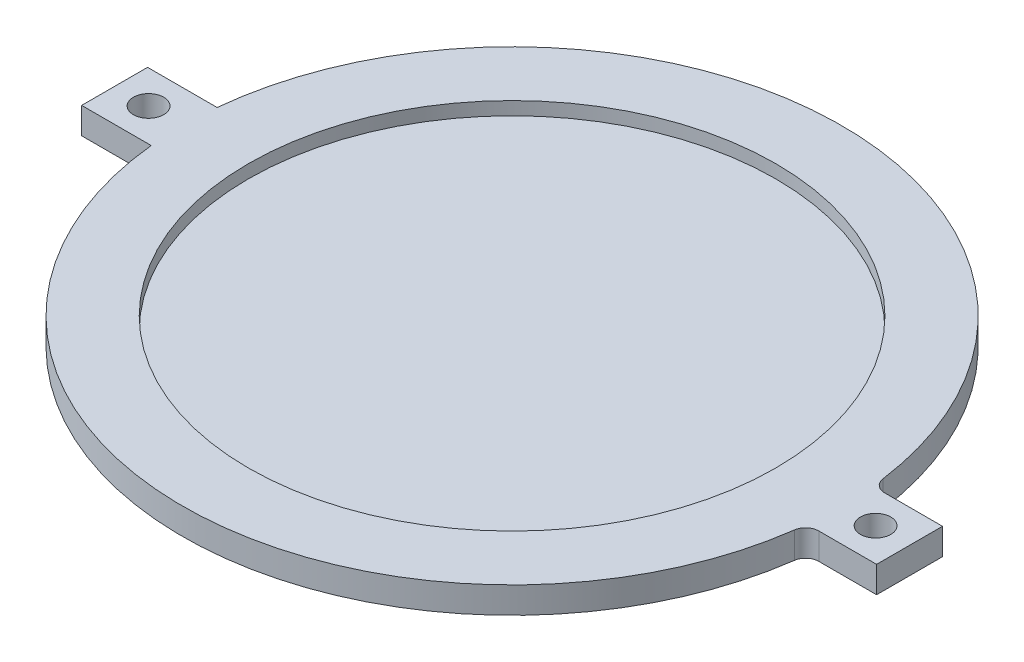
ISO-10303-21;
HEADER;
FILE_DESCRIPTION(('STEP AP214'),'2;1');
FILE_NAME('part.step','',(''),(''),'','','');
FILE_SCHEMA(('AUTOMOTIVE_DESIGN { 1 0 10303 214 1 1 1 1 }'));
ENDSEC;
DATA;
#1=APPLICATION_CONTEXT('core data for automotive mechanical design processes');
#2=APPLICATION_PROTOCOL_DEFINITION('international standard','automotive_design',2000,#1);
#3=PRODUCT_CONTEXT('',#1,'mechanical');
#4=PRODUCT('Part','Part','',(#3));
#5=PRODUCT_RELATED_PRODUCT_CATEGORY('part','',(#4));
#6=PRODUCT_DEFINITION_FORMATION('','',#4);
#7=PRODUCT_DEFINITION_CONTEXT('part definition',#1,'design');
#8=PRODUCT_DEFINITION('design','',#6,#7);
#9=PRODUCT_DEFINITION_SHAPE('','',#8);
#10=(LENGTH_UNIT() NAMED_UNIT(*) SI_UNIT(.MILLI.,.METRE.));
#11=(NAMED_UNIT(*) PLANE_ANGLE_UNIT() SI_UNIT($,.RADIAN.));
#12=(NAMED_UNIT(*) SI_UNIT($,.STERADIAN.) SOLID_ANGLE_UNIT());
#13=UNCERTAINTY_MEASURE_WITH_UNIT(LENGTH_MEASURE(1.E-05),#10,'distance_accuracy_value','');
#14=(GEOMETRIC_REPRESENTATION_CONTEXT(3) GLOBAL_UNCERTAINTY_ASSIGNED_CONTEXT((#13)) GLOBAL_UNIT_ASSIGNED_CONTEXT((#10,
#11,#12)) REPRESENTATION_CONTEXT('',''));
#15=CARTESIAN_POINT('',(0.,0.,0.));
#16=DIRECTION('',(0.,0.,1.));
#17=DIRECTION('',(1.,0.,0.));
#18=AXIS2_PLACEMENT_3D('',#15,#16,#17);
#19=CARTESIAN_POINT('',(0.,2.,0.));
#20=DIRECTION('',(0.,-1.,0.));
#21=DIRECTION('',(0.,0.,-1.));
#22=AXIS2_PLACEMENT_3D('',#19,#20,#21);
#23=CYLINDRICAL_SURFACE('',#22,25.);
#24=CARTESIAN_POINT('',(0.,0.,0.));
#25=DIRECTION('',(0.,1.,0.));
#26=DIRECTION('',(0.,0.,1.));
#27=AXIS2_PLACEMENT_3D('',#24,#25,#26);
#28=CIRCLE('',#27,25.);
#29=CARTESIAN_POINT('',(-24.8746859276655,0.,2.5));
#30=VERTEX_POINT('',#29);
#31=CARTESIAN_POINT('',(24.7724481307466,0.,3.36538461538462));
#32=VERTEX_POINT('',#31);
#33=EDGE_CURVE('E177',#30,#32,#28,.T.);
#34=ORIENTED_EDGE('',*,*,#33,.T.);
#35=DIRECTION('',(0.,-1.,0.));
#36=VECTOR('',#35,1.);
#37=CARTESIAN_POINT('',(24.7724481307466,2.,3.36538461538462));
#38=LINE('',#37,#36);
#39=CARTESIAN_POINT('',(24.7724481307466,2.,3.36538461538462));
#40=VERTEX_POINT('',#39);
#41=EDGE_CURVE('E68',#32,#40,#38,.F.);
#42=ORIENTED_EDGE('',*,*,#41,.T.);
#43=CARTESIAN_POINT('',(0.,2.,0.));
#44=DIRECTION('',(0.,1.,0.));
#45=DIRECTION('',(0.,0.,1.));
#46=AXIS2_PLACEMENT_3D('',#43,#44,#45);
#47=CIRCLE('',#46,25.);
#48=CARTESIAN_POINT('',(-24.8746859276655,2.,2.5));
#49=VERTEX_POINT('',#48);
#50=EDGE_CURVE('E142',#49,#40,#47,.T.);
#51=ORIENTED_EDGE('',*,*,#50,.F.);
#52=DIRECTION('',(0.,-1.,0.));
#53=VECTOR('',#52,1.);
#54=CARTESIAN_POINT('',(-24.8746859276655,2.,2.5));
#55=LINE('',#54,#53);
#56=EDGE_CURVE('E176',#49,#30,#55,.T.);
#57=ORIENTED_EDGE('',*,*,#56,.T.);
#58=EDGE_LOOP('',(#34,#42,#51,#57));
#59=FACE_BOUND('',#58,.T.);
#60=ADVANCED_FACE('F53',(#59),#23,.T.);
#61=CARTESIAN_POINT('',(0.,2.,2.5));
#62=DIRECTION('',(0.,0.,-1.));
#63=DIRECTION('',(-1.,0.,0.));
#64=AXIS2_PLACEMENT_3D('',#61,#62,#63);
#65=PLANE('',#64);
#66=DIRECTION('',(1.,0.,0.));
#67=VECTOR('',#66,1.);
#68=CARTESIAN_POINT('',(0.,2.,2.5));
#69=LINE('',#68,#67);
#70=CARTESIAN_POINT('',(25.7633460559765,2.,2.5));
#71=VERTEX_POINT('',#70);
#72=CARTESIAN_POINT('',(30.15,2.,2.5));
#73=VERTEX_POINT('',#72);
#74=EDGE_CURVE('E130',#71,#73,#69,.T.);
#75=ORIENTED_EDGE('',*,*,#74,.F.);
#76=DIRECTION('',(0.,1.,0.));
#77=VECTOR('',#76,1.);
#78=CARTESIAN_POINT('',(25.7633460559765,0.,2.5));
#79=LINE('',#78,#77);
#80=CARTESIAN_POINT('',(25.7633460559765,0.,2.5));
#81=VERTEX_POINT('',#80);
#82=EDGE_CURVE('E214',#71,#81,#79,.F.);
#83=ORIENTED_EDGE('',*,*,#82,.T.);
#84=DIRECTION('',(1.,0.,0.));
#85=VECTOR('',#84,1.);
#86=CARTESIAN_POINT('',(0.,0.,2.5));
#87=LINE('',#86,#85);
#88=CARTESIAN_POINT('',(30.15,0.,2.5));
#89=VERTEX_POINT('',#88);
#90=EDGE_CURVE('E147',#81,#89,#87,.T.);
#91=ORIENTED_EDGE('',*,*,#90,.T.);
#92=DIRECTION('',(0.,-1.,0.));
#93=VECTOR('',#92,1.);
#94=CARTESIAN_POINT('',(30.15,2.,2.5));
#95=LINE('',#94,#93);
#96=EDGE_CURVE('E145',#73,#89,#95,.T.);
#97=ORIENTED_EDGE('',*,*,#96,.F.);
#98=EDGE_LOOP('',(#75,#83,#91,#97));
#99=FACE_BOUND('',#98,.T.);
#100=ADVANCED_FACE('F146',(#99),#65,.F.);
#101=CARTESIAN_POINT('',(30.15,2.,0.));
#102=DIRECTION('',(-1.,0.,0.));
#103=DIRECTION('',(0.,0.,1.));
#104=AXIS2_PLACEMENT_3D('',#101,#102,#103);
#105=PLANE('',#104);
#106=DIRECTION('',(0.,0.,-1.));
#107=VECTOR('',#106,1.);
#108=CARTESIAN_POINT('',(30.15,0.,0.));
#109=LINE('',#108,#107);
#110=CARTESIAN_POINT('',(30.15,0.,-2.5));
#111=VERTEX_POINT('',#110);
#112=EDGE_CURVE('E182',#89,#111,#109,.T.);
#113=ORIENTED_EDGE('',*,*,#112,.T.);
#114=DIRECTION('',(0.,-1.,0.));
#115=VECTOR('',#114,1.);
#116=CARTESIAN_POINT('',(30.15,2.,-2.5));
#117=LINE('',#116,#115);
#118=CARTESIAN_POINT('',(30.15,2.,-2.5));
#119=VERTEX_POINT('',#118);
#120=EDGE_CURVE('E152',#119,#111,#117,.T.);
#121=ORIENTED_EDGE('',*,*,#120,.F.);
#122=DIRECTION('',(0.,0.,-1.));
#123=VECTOR('',#122,1.);
#124=CARTESIAN_POINT('',(30.15,2.,0.));
#125=LINE('',#124,#123);
#126=EDGE_CURVE('E136',#73,#119,#125,.T.);
#127=ORIENTED_EDGE('',*,*,#126,.F.);
#128=ORIENTED_EDGE('',*,*,#96,.T.);
#129=EDGE_LOOP('',(#113,#121,#127,#128));
#130=FACE_BOUND('',#129,.T.);
#131=ADVANCED_FACE('F154',(#130),#105,.F.);
#132=CARTESIAN_POINT('',(0.,2.,-2.5));
#133=DIRECTION('',(0.,0.,-1.));
#134=DIRECTION('',(-1.,0.,0.));
#135=AXIS2_PLACEMENT_3D('',#132,#133,#134);
#136=PLANE('',#135);
#137=DIRECTION('',(1.,0.,0.));
#138=VECTOR('',#137,1.);
#139=CARTESIAN_POINT('',(0.,0.,-2.5));
#140=LINE('',#139,#138);
#141=CARTESIAN_POINT('',(25.7633460559765,0.,-2.5));
#142=VERTEX_POINT('',#141);
#143=EDGE_CURVE('E184',#142,#111,#140,.T.);
#144=ORIENTED_EDGE('',*,*,#143,.F.);
#145=DIRECTION('',(0.,-1.,0.));
#146=VECTOR('',#145,1.);
#147=CARTESIAN_POINT('',(25.7633460559765,2.,-2.5));
#148=LINE('',#147,#146);
#149=CARTESIAN_POINT('',(25.7633460559765,2.,-2.5));
#150=VERTEX_POINT('',#149);
#151=EDGE_CURVE('E212',#142,#150,#148,.F.);
#152=ORIENTED_EDGE('',*,*,#151,.T.);
#153=DIRECTION('',(1.,0.,0.));
#154=VECTOR('',#153,1.);
#155=CARTESIAN_POINT('',(0.,2.,-2.5));
#156=LINE('',#155,#154);
#157=EDGE_CURVE('E156',#150,#119,#156,.T.);
#158=ORIENTED_EDGE('',*,*,#157,.T.);
#159=ORIENTED_EDGE('',*,*,#120,.T.);
#160=EDGE_LOOP('',(#144,#152,#158,#159));
#161=FACE_BOUND('',#160,.T.);
#162=ADVANCED_FACE('F236',(#161),#136,.T.);
#163=CARTESIAN_POINT('',(24.7724481307466,2.,-3.36538461538462));
#164=VERTEX_POINT('',#163);
#165=CARTESIAN_POINT('',(-24.8746859276655,2.,-2.5));
#166=VERTEX_POINT('',#165);
#167=EDGE_CURVE('E158',#164,#166,#47,.T.);
#168=ORIENTED_EDGE('',*,*,#167,.F.);
#169=DIRECTION('',(0.,-1.,0.));
#170=VECTOR('',#169,1.);
#171=CARTESIAN_POINT('',(24.7724481307466,2.,-3.36538461538462));
#172=LINE('',#171,#170);
#173=CARTESIAN_POINT('',(24.7724481307466,0.,-3.36538461538462));
#174=VERTEX_POINT('',#173);
#175=EDGE_CURVE('E151',#164,#174,#172,.T.);
#176=ORIENTED_EDGE('',*,*,#175,.T.);
#177=CARTESIAN_POINT('',(-24.8746859276655,0.,-2.5));
#178=VERTEX_POINT('',#177);
#179=EDGE_CURVE('E180',#174,#178,#28,.T.);
#180=ORIENTED_EDGE('',*,*,#179,.T.);
#181=DIRECTION('',(0.,-1.,0.));
#182=VECTOR('',#181,1.);
#183=CARTESIAN_POINT('',(-24.8746859276655,2.,-2.5));
#184=LINE('',#183,#182);
#185=EDGE_CURVE('E206',#166,#178,#184,.T.);
#186=ORIENTED_EDGE('',*,*,#185,.F.);
#187=EDGE_LOOP('',(#168,#176,#180,#186));
#188=FACE_BOUND('',#187,.T.);
#189=ADVANCED_FACE('F227',(#188),#23,.T.);
#190=CARTESIAN_POINT('',(0.,2.,-2.5));
#191=DIRECTION('',(0.,0.,1.));
#192=DIRECTION('',(1.,0.,0.));
#193=AXIS2_PLACEMENT_3D('',#190,#191,#192);
#194=PLANE('',#193);
#195=DIRECTION('',(-1.,0.,0.));
#196=VECTOR('',#195,1.);
#197=CARTESIAN_POINT('',(0.,0.,-2.5));
#198=LINE('',#197,#196);
#199=CARTESIAN_POINT('',(-30.15,0.,-2.5));
#200=VERTEX_POINT('',#199);
#201=EDGE_CURVE('E186',#178,#200,#198,.T.);
#202=ORIENTED_EDGE('',*,*,#201,.T.);
#203=DIRECTION('',(0.,-1.,0.));
#204=VECTOR('',#203,1.);
#205=CARTESIAN_POINT('',(-30.15,2.,-2.5));
#206=LINE('',#205,#204);
#207=CARTESIAN_POINT('',(-30.15,2.,-2.5));
#208=VERTEX_POINT('',#207);
#209=EDGE_CURVE('E204',#208,#200,#206,.T.);
#210=ORIENTED_EDGE('',*,*,#209,.F.);
#211=DIRECTION('',(-1.,0.,0.));
#212=VECTOR('',#211,1.);
#213=CARTESIAN_POINT('',(0.,2.,-2.5));
#214=LINE('',#213,#212);
#215=EDGE_CURVE('E162',#166,#208,#214,.T.);
#216=ORIENTED_EDGE('',*,*,#215,.F.);
#217=ORIENTED_EDGE('',*,*,#185,.T.);
#218=EDGE_LOOP('',(#202,#210,#216,#217));
#219=FACE_BOUND('',#218,.T.);
#220=ADVANCED_FACE('F243',(#219),#194,.F.);
#221=CARTESIAN_POINT('',(-30.15,2.,0.));
#222=DIRECTION('',(-1.,0.,0.));
#223=DIRECTION('',(0.,0.,1.));
#224=AXIS2_PLACEMENT_3D('',#221,#222,#223);
#225=PLANE('',#224);
#226=DIRECTION('',(0.,0.,-1.));
#227=VECTOR('',#226,1.);
#228=CARTESIAN_POINT('',(-30.15,0.,0.));
#229=LINE('',#228,#227);
#230=CARTESIAN_POINT('',(-30.15,0.,2.5));
#231=VERTEX_POINT('',#230);
#232=EDGE_CURVE('E189',#231,#200,#229,.T.);
#233=ORIENTED_EDGE('',*,*,#232,.F.);
#234=DIRECTION('',(0.,-1.,0.));
#235=VECTOR('',#234,1.);
#236=CARTESIAN_POINT('',(-30.15,2.,2.5));
#237=LINE('',#236,#235);
#238=CARTESIAN_POINT('',(-30.15,2.,2.5));
#239=VERTEX_POINT('',#238);
#240=EDGE_CURVE('E202',#239,#231,#237,.T.);
#241=ORIENTED_EDGE('',*,*,#240,.F.);
#242=DIRECTION('',(0.,0.,-1.));
#243=VECTOR('',#242,1.);
#244=CARTESIAN_POINT('',(-30.15,2.,0.));
#245=LINE('',#244,#243);
#246=EDGE_CURVE('E164',#239,#208,#245,.T.);
#247=ORIENTED_EDGE('',*,*,#246,.T.);
#248=ORIENTED_EDGE('',*,*,#209,.T.);
#249=EDGE_LOOP('',(#233,#241,#247,#248));
#250=FACE_BOUND('',#249,.T.);
#251=ADVANCED_FACE('F255',(#250),#225,.T.);
#252=CARTESIAN_POINT('',(27.575,2.,0.));
#253=DIRECTION('',(0.,-1.,0.));
#254=DIRECTION('',(0.,0.,-1.));
#255=AXIS2_PLACEMENT_3D('',#252,#253,#254);
#256=CYLINDRICAL_SURFACE('',#255,1.15);
#257=CARTESIAN_POINT('',(27.575,2.,0.));
#258=DIRECTION('',(0.,1.,0.));
#259=DIRECTION('',(0.,0.,1.));
#260=AXIS2_PLACEMENT_3D('',#257,#258,#259);
#261=CIRCLE('',#260,1.15);
#262=CARTESIAN_POINT('',(27.575,2.,1.15));
#263=VERTEX_POINT('',#262);
#264=EDGE_CURVE('E170',#263,#263,#261,.T.);
#265=ORIENTED_EDGE('',*,*,#264,.T.);
#266=EDGE_LOOP('',(#265));
#267=FACE_BOUND('',#266,.T.);
#268=CARTESIAN_POINT('',(27.575,0.,0.));
#269=DIRECTION('',(0.,1.,0.));
#270=DIRECTION('',(0.,0.,1.));
#271=AXIS2_PLACEMENT_3D('',#268,#269,#270);
#272=CIRCLE('',#271,1.15);
#273=CARTESIAN_POINT('',(27.575,0.,1.15));
#274=VERTEX_POINT('',#273);
#275=EDGE_CURVE('E195',#274,#274,#272,.T.);
#276=ORIENTED_EDGE('',*,*,#275,.F.);
#277=EDGE_LOOP('',(#276));
#278=FACE_BOUND('',#277,.T.);
#279=ADVANCED_FACE('F259',(#267,#278),#256,.F.);
#280=CARTESIAN_POINT('',(0.,2.,2.5));
#281=DIRECTION('',(0.,0.,1.));
#282=DIRECTION('',(1.,0.,0.));
#283=AXIS2_PLACEMENT_3D('',#280,#281,#282);
#284=PLANE('',#283);
#285=DIRECTION('',(-1.,0.,0.));
#286=VECTOR('',#285,1.);
#287=CARTESIAN_POINT('',(0.,0.,2.5));
#288=LINE('',#287,#286);
#289=EDGE_CURVE('E192',#30,#231,#288,.T.);
#290=ORIENTED_EDGE('',*,*,#289,.F.);
#291=ORIENTED_EDGE('',*,*,#56,.F.);
#292=DIRECTION('',(-1.,0.,0.));
#293=VECTOR('',#292,1.);
#294=CARTESIAN_POINT('',(0.,2.,2.5));
#295=LINE('',#294,#293);
#296=EDGE_CURVE('E167',#49,#239,#295,.T.);
#297=ORIENTED_EDGE('',*,*,#296,.T.);
#298=ORIENTED_EDGE('',*,*,#240,.T.);
#299=EDGE_LOOP('',(#290,#291,#297,#298));
#300=FACE_BOUND('',#299,.T.);
#301=ADVANCED_FACE('F261',(#300),#284,.T.);
#302=CARTESIAN_POINT('',(-27.575,2.,0.));
#303=DIRECTION('',(0.,-1.,0.));
#304=DIRECTION('',(0.,0.,-1.));
#305=AXIS2_PLACEMENT_3D('',#302,#303,#304);
#306=CYLINDRICAL_SURFACE('',#305,1.15);
#307=CARTESIAN_POINT('',(-27.575,2.,0.));
#308=DIRECTION('',(0.,1.,0.));
#309=DIRECTION('',(0.,0.,1.));
#310=AXIS2_PLACEMENT_3D('',#307,#308,#309);
#311=CIRCLE('',#310,1.15);
#312=CARTESIAN_POINT('',(-27.575,2.,1.15));
#313=VERTEX_POINT('',#312);
#314=EDGE_CURVE('E173',#313,#313,#311,.F.);
#315=ORIENTED_EDGE('',*,*,#314,.F.);
#316=EDGE_LOOP('',(#315));
#317=FACE_BOUND('',#316,.T.);
#318=CARTESIAN_POINT('',(-27.575,0.,0.));
#319=DIRECTION('',(0.,1.,0.));
#320=DIRECTION('',(0.,0.,1.));
#321=AXIS2_PLACEMENT_3D('',#318,#319,#320);
#322=CIRCLE('',#321,1.15);
#323=CARTESIAN_POINT('',(-27.575,0.,1.15));
#324=VERTEX_POINT('',#323);
#325=EDGE_CURVE('E198',#324,#324,#322,.F.);
#326=ORIENTED_EDGE('',*,*,#325,.T.);
#327=EDGE_LOOP('',(#326));
#328=FACE_BOUND('',#327,.T.);
#329=ADVANCED_FACE('F264',(#317,#328),#306,.F.);
#330=CARTESIAN_POINT('',(0.,2.,0.));
#331=DIRECTION('',(0.,1.,0.));
#332=DIRECTION('',(0.,0.,1.));
#333=AXIS2_PLACEMENT_3D('',#330,#331,#332);
#334=PLANE('',#333);
#335=CARTESIAN_POINT('',(0.,2.,0.));
#336=DIRECTION('',(0.,1.,0.));
#337=DIRECTION('',(0.,0.,1.));
#338=AXIS2_PLACEMENT_3D('',#335,#336,#337);
#339=CIRCLE('',#338,20.);
#340=CARTESIAN_POINT('',(0.,2.,20.));
#341=VERTEX_POINT('',#340);
#342=EDGE_CURVE('E287',#341,#341,#339,.T.);
#343=ORIENTED_EDGE('',*,*,#342,.F.);
#344=EDGE_LOOP('',(#343));
#345=FACE_BOUND('',#344,.T.);
#346=ORIENTED_EDGE('',*,*,#50,.T.);
#347=CARTESIAN_POINT('',(25.7633460559765,2.,3.5));
#348=DIRECTION('',(0.,1.,0.));
#349=DIRECTION('',(0.,0.,1.));
#350=AXIS2_PLACEMENT_3D('',#347,#348,#349);
#351=CIRCLE('',#350,1.);
#352=EDGE_CURVE('E11',#40,#71,#351,.F.);
#353=ORIENTED_EDGE('',*,*,#352,.T.);
#354=ORIENTED_EDGE('',*,*,#74,.T.);
#355=ORIENTED_EDGE('',*,*,#126,.T.);
#356=ORIENTED_EDGE('',*,*,#157,.F.);
#357=CARTESIAN_POINT('',(25.7633460559765,2.,-3.5));
#358=DIRECTION('',(0.,1.,0.));
#359=DIRECTION('',(0.,0.,1.));
#360=AXIS2_PLACEMENT_3D('',#357,#358,#359);
#361=CIRCLE('',#360,1.);
#362=EDGE_CURVE('E219',#150,#164,#361,.F.);
#363=ORIENTED_EDGE('',*,*,#362,.T.);
#364=ORIENTED_EDGE('',*,*,#167,.T.);
#365=ORIENTED_EDGE('',*,*,#215,.T.);
#366=ORIENTED_EDGE('',*,*,#246,.F.);
#367=ORIENTED_EDGE('',*,*,#296,.F.);
#368=EDGE_LOOP('',(#346,#353,#354,#355,#356,#363,#364,#365,#366,#367));
#369=FACE_BOUND('',#368,.T.);
#370=ORIENTED_EDGE('',*,*,#264,.F.);
#371=EDGE_LOOP('',(#370));
#372=FACE_BOUND('',#371,.T.);
#373=ORIENTED_EDGE('',*,*,#314,.T.);
#374=EDGE_LOOP('',(#373));
#375=FACE_BOUND('',#374,.T.);
#376=ADVANCED_FACE('F132',(#345,#369,#372,#375),#334,.T.);
#377=CARTESIAN_POINT('',(0.,0.,0.));
#378=DIRECTION('',(0.,1.,0.));
#379=DIRECTION('',(0.,0.,1.));
#380=AXIS2_PLACEMENT_3D('',#377,#378,#379);
#381=PLANE('',#380);
#382=ORIENTED_EDGE('',*,*,#33,.F.);
#383=ORIENTED_EDGE('',*,*,#289,.T.);
#384=ORIENTED_EDGE('',*,*,#232,.T.);
#385=ORIENTED_EDGE('',*,*,#201,.F.);
#386=ORIENTED_EDGE('',*,*,#179,.F.);
#387=CARTESIAN_POINT('',(25.7633460559765,0.,-3.5));
#388=DIRECTION('',(0.,1.,0.));
#389=DIRECTION('',(0.,0.,1.));
#390=AXIS2_PLACEMENT_3D('',#387,#388,#389);
#391=CIRCLE('',#390,1.);
#392=EDGE_CURVE('E217',#174,#142,#391,.T.);
#393=ORIENTED_EDGE('',*,*,#392,.T.);
#394=ORIENTED_EDGE('',*,*,#143,.T.);
#395=ORIENTED_EDGE('',*,*,#112,.F.);
#396=ORIENTED_EDGE('',*,*,#90,.F.);
#397=CARTESIAN_POINT('',(25.7633460559765,0.,3.5));
#398=DIRECTION('',(0.,1.,0.));
#399=DIRECTION('',(0.,0.,1.));
#400=AXIS2_PLACEMENT_3D('',#397,#398,#399);
#401=CIRCLE('',#400,1.);
#402=EDGE_CURVE('E61',#81,#32,#401,.T.);
#403=ORIENTED_EDGE('',*,*,#402,.T.);
#404=EDGE_LOOP('',(#382,#383,#384,#385,#386,#393,#394,#395,#396,#403));
#405=FACE_BOUND('',#404,.T.);
#406=ORIENTED_EDGE('',*,*,#275,.T.);
#407=EDGE_LOOP('',(#406));
#408=FACE_BOUND('',#407,.T.);
#409=ORIENTED_EDGE('',*,*,#325,.F.);
#410=EDGE_LOOP('',(#409));
#411=FACE_BOUND('',#410,.T.);
#412=ADVANCED_FACE('F232',(#405,#408,#411),#381,.F.);
#413=CARTESIAN_POINT('',(25.7633460559765,2.,-3.5));
#414=DIRECTION('',(0.,-1.,0.));
#415=DIRECTION('',(0.,0.,-1.));
#416=AXIS2_PLACEMENT_3D('',#413,#414,#415);
#417=CYLINDRICAL_SURFACE('',#416,1.);
#418=ORIENTED_EDGE('',*,*,#362,.F.);
#419=ORIENTED_EDGE('',*,*,#151,.F.);
#420=ORIENTED_EDGE('',*,*,#392,.F.);
#421=ORIENTED_EDGE('',*,*,#175,.F.);
#422=EDGE_LOOP('',(#418,#419,#420,#421));
#423=FACE_BOUND('',#422,.T.);
#424=ADVANCED_FACE('F230',(#423),#417,.F.);
#425=CARTESIAN_POINT('',(25.7633460559765,2.,3.5));
#426=DIRECTION('',(0.,-1.,0.));
#427=DIRECTION('',(0.,0.,-1.));
#428=AXIS2_PLACEMENT_3D('',#425,#426,#427);
#429=CYLINDRICAL_SURFACE('',#428,1.);
#430=ORIENTED_EDGE('',*,*,#352,.F.);
#431=ORIENTED_EDGE('',*,*,#41,.F.);
#432=ORIENTED_EDGE('',*,*,#402,.F.);
#433=ORIENTED_EDGE('',*,*,#82,.F.);
#434=EDGE_LOOP('',(#430,#431,#432,#433));
#435=FACE_BOUND('',#434,.T.);
#436=ADVANCED_FACE('F55',(#435),#429,.F.);
#437=CARTESIAN_POINT('',(0.,1.,0.));
#438=DIRECTION('',(0.,1.,0.));
#439=DIRECTION('',(0.,0.,1.));
#440=AXIS2_PLACEMENT_3D('',#437,#438,#439);
#441=CYLINDRICAL_SURFACE('',#440,20.);
#442=CARTESIAN_POINT('',(0.,1.,0.));
#443=DIRECTION('',(0.,1.,0.));
#444=DIRECTION('',(0.,0.,1.));
#445=AXIS2_PLACEMENT_3D('',#442,#443,#444);
#446=CIRCLE('',#445,20.);
#447=CARTESIAN_POINT('',(0.,1.,20.));
#448=VERTEX_POINT('',#447);
#449=EDGE_CURVE('E179',#448,#448,#446,.T.);
#450=ORIENTED_EDGE('',*,*,#449,.F.);
#451=EDGE_LOOP('',(#450));
#452=FACE_BOUND('',#451,.T.);
#453=ORIENTED_EDGE('',*,*,#342,.T.);
#454=EDGE_LOOP('',(#453));
#455=FACE_BOUND('',#454,.T.);
#456=ADVANCED_FACE('F276',(#452,#455),#441,.F.);
#457=CARTESIAN_POINT('',(0.,1.,0.));
#458=DIRECTION('',(0.,1.,0.));
#459=DIRECTION('',(0.,0.,1.));
#460=AXIS2_PLACEMENT_3D('',#457,#458,#459);
#461=PLANE('',#460);
#462=ORIENTED_EDGE('',*,*,#449,.T.);
#463=EDGE_LOOP('',(#462));
#464=FACE_BOUND('',#463,.T.);
#465=ADVANCED_FACE('F279',(#464),#461,.T.);
#466=CLOSED_SHELL('',(#60,#100,#131,#162,#189,#220,#251,#279,#301,#329,#376,#412,#424,#436,#456,#465));
#467=MANIFOLD_SOLID_BREP('B2',#466);
#468=ADVANCED_BREP_SHAPE_REPRESENTATION('',(#18,#467),#14);
#469=SHAPE_DEFINITION_REPRESENTATION(#9,#468);
ENDSEC;
END-ISO-10303-21;
